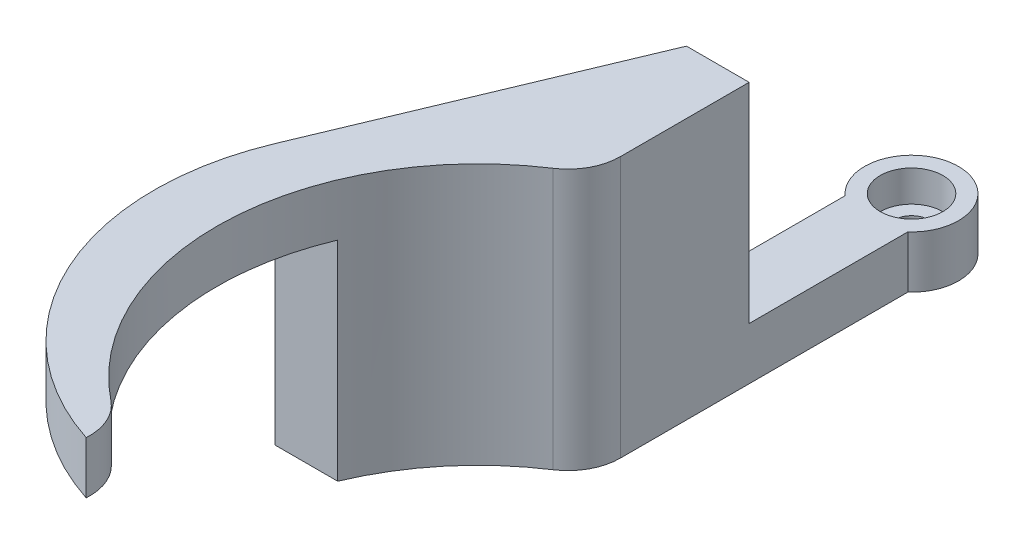
ISO-10303-21;
HEADER;
FILE_DESCRIPTION(('STEP AP214'),'2;1');
FILE_NAME('part.step','',(''),(''),'','','');
FILE_SCHEMA(('AUTOMOTIVE_DESIGN { 1 0 10303 214 1 1 1 1 }'));
ENDSEC;
DATA;
#1=APPLICATION_CONTEXT('core data for automotive mechanical design processes');
#2=APPLICATION_PROTOCOL_DEFINITION('international standard','automotive_design',2000,#1);
#3=PRODUCT_CONTEXT('',#1,'mechanical');
#4=PRODUCT('Part','Part','',(#3));
#5=PRODUCT_RELATED_PRODUCT_CATEGORY('part','',(#4));
#6=PRODUCT_DEFINITION_FORMATION('','',#4);
#7=PRODUCT_DEFINITION_CONTEXT('part definition',#1,'design');
#8=PRODUCT_DEFINITION('design','',#6,#7);
#9=PRODUCT_DEFINITION_SHAPE('','',#8);
#10=(LENGTH_UNIT() NAMED_UNIT(*) SI_UNIT(.MILLI.,.METRE.));
#11=(NAMED_UNIT(*) PLANE_ANGLE_UNIT() SI_UNIT($,.RADIAN.));
#12=(NAMED_UNIT(*) SI_UNIT($,.STERADIAN.) SOLID_ANGLE_UNIT());
#13=UNCERTAINTY_MEASURE_WITH_UNIT(LENGTH_MEASURE(1.E-05),#10,'distance_accuracy_value','');
#14=(GEOMETRIC_REPRESENTATION_CONTEXT(3) GLOBAL_UNCERTAINTY_ASSIGNED_CONTEXT((#13)) GLOBAL_UNIT_ASSIGNED_CONTEXT((#10,
#11,#12)) REPRESENTATION_CONTEXT('',''));
#15=CARTESIAN_POINT('',(0.,0.,0.));
#16=DIRECTION('',(0.,0.,1.));
#17=DIRECTION('',(1.,0.,0.));
#18=AXIS2_PLACEMENT_3D('',#15,#16,#17);
#19=CARTESIAN_POINT('',(0.,5.,0.));
#20=DIRECTION('',(0.,1.,0.));
#21=DIRECTION('',(0.,0.,1.));
#22=AXIS2_PLACEMENT_3D('',#19,#20,#21);
#23=PLANE('',#22);
#24=CARTESIAN_POINT('',(0.,5.,0.));
#25=DIRECTION('',(0.,1.,0.));
#26=DIRECTION('',(0.,0.,1.));
#27=AXIS2_PLACEMENT_3D('',#24,#25,#26);
#28=CIRCLE('',#27,3.);
#29=CARTESIAN_POINT('',(0.,5.,3.));
#30=VERTEX_POINT('',#29);
#31=EDGE_CURVE('E169',#30,#30,#28,.T.);
#32=ORIENTED_EDGE('',*,*,#31,.F.);
#33=EDGE_LOOP('',(#32));
#34=FACE_BOUND('',#33,.T.);
#35=DIRECTION('',(0.,0.,1.));
#36=VECTOR('',#35,1.);
#37=CARTESIAN_POINT('',(-3.,5.,7.41619848709566));
#38=LINE('',#37,#36);
#39=CARTESIAN_POINT('',(-3.,5.,3.35410196624968));
#40=VERTEX_POINT('',#39);
#41=CARTESIAN_POINT('',(-2.99999999999999,5.,18.5500745429482));
#42=VERTEX_POINT('',#41);
#43=EDGE_CURVE('E172',#40,#42,#38,.T.);
#44=ORIENTED_EDGE('',*,*,#43,.T.);
#45=DIRECTION('',(1.,0.,0.));
#46=VECTOR('',#45,1.);
#47=CARTESIAN_POINT('',(0.,5.,18.5500745429482));
#48=LINE('',#47,#46);
#49=CARTESIAN_POINT('',(3.,5.,18.5500745429482));
#50=VERTEX_POINT('',#49);
#51=EDGE_CURVE('E61',#42,#50,#48,.T.);
#52=ORIENTED_EDGE('',*,*,#51,.T.);
#53=DIRECTION('',(0.,0.,-1.));
#54=VECTOR('',#53,1.);
#55=CARTESIAN_POINT('',(3.00000000000001,5.,43.8541019662497));
#56=LINE('',#55,#54);
#57=CARTESIAN_POINT('',(3.,5.,3.35410196624968));
#58=VERTEX_POINT('',#57);
#59=EDGE_CURVE('E175',#50,#58,#56,.T.);
#60=ORIENTED_EDGE('',*,*,#59,.T.);
#61=CARTESIAN_POINT('',(0.,5.,0.));
#62=DIRECTION('',(0.,1.,0.));
#63=DIRECTION('',(0.,0.,1.));
#64=AXIS2_PLACEMENT_3D('',#61,#62,#63);
#65=CIRCLE('',#64,4.5);
#66=EDGE_CURVE('E179',#58,#40,#65,.T.);
#67=ORIENTED_EDGE('',*,*,#66,.T.);
#68=EDGE_LOOP('',(#44,#52,#60,#67));
#69=FACE_BOUND('',#68,.T.);
#70=ADVANCED_FACE('F45',(#34,#69),#23,.T.);
#71=CARTESIAN_POINT('',(0.,-4.66690475583121,0.));
#72=DIRECTION('',(0.,1.,0.));
#73=DIRECTION('',(0.,0.,1.));
#74=AXIS2_PLACEMENT_3D('',#71,#72,#73);
#75=CYLINDRICAL_SURFACE('',#74,1.65);
#76=CARTESIAN_POINT('',(0.,0.,0.));
#77=DIRECTION('',(0.,1.,0.));
#78=DIRECTION('',(0.,0.,1.));
#79=AXIS2_PLACEMENT_3D('',#76,#77,#78);
#80=CIRCLE('',#79,1.65);
#81=CARTESIAN_POINT('',(0.,0.,1.65));
#82=VERTEX_POINT('',#81);
#83=EDGE_CURVE('E157',#82,#82,#80,.F.);
#84=ORIENTED_EDGE('',*,*,#83,.T.);
#85=EDGE_LOOP('',(#84));
#86=FACE_BOUND('',#85,.T.);
#87=CARTESIAN_POINT('',(0.,2.,0.));
#88=DIRECTION('',(0.,1.,0.));
#89=DIRECTION('',(0.,0.,1.));
#90=AXIS2_PLACEMENT_3D('',#87,#88,#89);
#91=CIRCLE('',#90,1.65);
#92=CARTESIAN_POINT('',(0.,2.,1.65));
#93=VERTEX_POINT('',#92);
#94=EDGE_CURVE('E158',#93,#93,#91,.F.);
#95=ORIENTED_EDGE('',*,*,#94,.F.);
#96=EDGE_LOOP('',(#95));
#97=FACE_BOUND('',#96,.T.);
#98=ADVANCED_FACE('F274',(#86,#97),#75,.F.);
#99=CARTESIAN_POINT('',(3.,5.,3.35410196624968));
#100=DIRECTION('',(-1.,0.,0.));
#101=DIRECTION('',(0.,0.,1.));
#102=AXIS2_PLACEMENT_3D('',#99,#100,#101);
#103=PLANE('',#102);
#104=ORIENTED_EDGE('',*,*,#59,.F.);
#105=DIRECTION('',(0.,-1.,0.));
#106=VECTOR('',#105,1.);
#107=CARTESIAN_POINT('',(3.,20.,18.5500745429482));
#108=LINE('',#107,#106);
#109=CARTESIAN_POINT('',(3.,25.,18.5500745429482));
#110=VERTEX_POINT('',#109);
#111=EDGE_CURVE('E140',#110,#50,#108,.T.);
#112=ORIENTED_EDGE('',*,*,#111,.F.);
#113=DIRECTION('',(0.,0.,-1.));
#114=VECTOR('',#113,1.);
#115=CARTESIAN_POINT('',(3.00000000000001,25.,30.8819886854511));
#116=LINE('',#115,#114);
#117=CARTESIAN_POINT('',(3.00000000000001,25.,30.8819886854511));
#118=VERTEX_POINT('',#117);
#119=EDGE_CURVE('E219',#118,#110,#116,.T.);
#120=ORIENTED_EDGE('',*,*,#119,.F.);
#121=DIRECTION('',(0.,-1.,0.));
#122=VECTOR('',#121,1.);
#123=CARTESIAN_POINT('',(3.00000000000001,0.,30.8819886854511));
#124=LINE('',#123,#122);
#125=CARTESIAN_POINT('',(3.00000000000001,0.,30.8819886854511));
#126=VERTEX_POINT('',#125);
#127=EDGE_CURVE('E11',#118,#126,#124,.T.);
#128=ORIENTED_EDGE('',*,*,#127,.T.);
#129=DIRECTION('',(0.,0.,-1.));
#130=VECTOR('',#129,1.);
#131=CARTESIAN_POINT('',(3.,0.,3.35410196624968));
#132=LINE('',#131,#130);
#133=CARTESIAN_POINT('',(3.,0.,3.35410196624968));
#134=VERTEX_POINT('',#133);
#135=EDGE_CURVE('E163',#126,#134,#132,.T.);
#136=ORIENTED_EDGE('',*,*,#135,.T.);
#137=DIRECTION('',(0.,-1.,0.));
#138=VECTOR('',#137,1.);
#139=CARTESIAN_POINT('',(3.,5.,3.35410196624968));
#140=LINE('',#139,#138);
#141=EDGE_CURVE('E195',#58,#134,#140,.T.);
#142=ORIENTED_EDGE('',*,*,#141,.F.);
#143=EDGE_LOOP('',(#104,#112,#120,#128,#136,#142));
#144=FACE_BOUND('',#143,.T.);
#145=ADVANCED_FACE('F287',(#144),#103,.F.);
#146=CARTESIAN_POINT('',(0.,5.,0.));
#147=DIRECTION('',(0.,-1.,0.));
#148=DIRECTION('',(0.,0.,-1.));
#149=AXIS2_PLACEMENT_3D('',#146,#147,#148);
#150=CYLINDRICAL_SURFACE('',#149,4.5);
#151=CARTESIAN_POINT('',(0.,0.,0.));
#152=DIRECTION('',(0.,1.,0.));
#153=DIRECTION('',(0.,0.,1.));
#154=AXIS2_PLACEMENT_3D('',#151,#152,#153);
#155=CIRCLE('',#154,4.5);
#156=CARTESIAN_POINT('',(-3.,0.,3.35410196624968));
#157=VERTEX_POINT('',#156);
#158=EDGE_CURVE('E186',#134,#157,#155,.T.);
#159=ORIENTED_EDGE('',*,*,#158,.T.);
#160=DIRECTION('',(0.,-1.,0.));
#161=VECTOR('',#160,1.);
#162=CARTESIAN_POINT('',(-3.,5.,3.35410196624968));
#163=LINE('',#162,#161);
#164=EDGE_CURVE('E183',#40,#157,#163,.T.);
#165=ORIENTED_EDGE('',*,*,#164,.F.);
#166=ORIENTED_EDGE('',*,*,#66,.F.);
#167=ORIENTED_EDGE('',*,*,#141,.T.);
#168=EDGE_LOOP('',(#159,#165,#166,#167));
#169=FACE_BOUND('',#168,.T.);
#170=ADVANCED_FACE('F311',(#169),#150,.T.);
#171=CARTESIAN_POINT('',(-3.,5.,3.35410196624968));
#172=DIRECTION('',(1.,0.,0.));
#173=DIRECTION('',(0.,0.,-1.));
#174=AXIS2_PLACEMENT_3D('',#171,#172,#173);
#175=PLANE('',#174);
#176=DIRECTION('',(0.,0.,1.));
#177=VECTOR('',#176,1.);
#178=CARTESIAN_POINT('',(-3.,0.,3.35410196624968));
#179=LINE('',#178,#177);
#180=CARTESIAN_POINT('',(-2.99999999999999,0.,18.5500745429482));
#181=VERTEX_POINT('',#180);
#182=EDGE_CURVE('E176',#157,#181,#179,.T.);
#183=ORIENTED_EDGE('',*,*,#182,.T.);
#184=DIRECTION('',(0.,1.,0.));
#185=VECTOR('',#184,1.);
#186=CARTESIAN_POINT('',(-2.99999999999999,0.,18.5500745429482));
#187=LINE('',#186,#185);
#188=EDGE_CURVE('E259',#181,#42,#187,.T.);
#189=ORIENTED_EDGE('',*,*,#188,.T.);
#190=ORIENTED_EDGE('',*,*,#43,.F.);
#191=ORIENTED_EDGE('',*,*,#164,.T.);
#192=EDGE_LOOP('',(#183,#189,#190,#191));
#193=FACE_BOUND('',#192,.T.);
#194=ADVANCED_FACE('F309',(#193),#175,.F.);
#195=CARTESIAN_POINT('',(0.,0.,0.));
#196=DIRECTION('',(0.,1.,0.));
#197=DIRECTION('',(0.,0.,1.));
#198=AXIS2_PLACEMENT_3D('',#195,#196,#197);
#199=PLANE('',#198);
#200=CARTESIAN_POINT('',(14.4495202218953,0.,55.9700991059163));
#201=DIRECTION('',(0.,-1.,0.));
#202=DIRECTION('',(0.,0.,1.));
#203=AXIS2_PLACEMENT_3D('',#200,#201,#202);
#204=CIRCLE('',#203,25.);
#205=CARTESIAN_POINT('',(-8.61496768407357,0.,46.3249242689621));
#206=VERTEX_POINT('',#205);
#207=CARTESIAN_POINT('',(0.741586703649219,0.,35.0633404221953));
#208=VERTEX_POINT('',#207);
#209=EDGE_CURVE('E131',#206,#208,#204,.T.);
#210=ORIENTED_EDGE('',*,*,#209,.F.);
#211=DIRECTION('',(-1.,0.,0.));
#212=VECTOR('',#211,1.);
#213=CARTESIAN_POINT('',(-8.61496768407357,0.,46.3249242689621));
#214=LINE('',#213,#212);
#215=CARTESIAN_POINT('',(-14.6149676840736,0.,46.3249242689621));
#216=VERTEX_POINT('',#215);
#217=EDGE_CURVE('E143',#206,#216,#214,.T.);
#218=ORIENTED_EDGE('',*,*,#217,.T.);
#219=DIRECTION('',(-0.38580699347817,0.,0.922579516238755));
#220=VECTOR('',#219,1.);
#221=CARTESIAN_POINT('',(-2.99999999999999,0.,18.5500745429482));
#222=LINE('',#221,#220);
#223=EDGE_CURVE('E139',#181,#216,#222,.T.);
#224=ORIENTED_EDGE('',*,*,#223,.F.);
#225=ORIENTED_EDGE('',*,*,#182,.F.);
#226=ORIENTED_EDGE('',*,*,#158,.F.);
#227=ORIENTED_EDGE('',*,*,#135,.F.);
#228=CARTESIAN_POINT('',(-1.99999999999999,0.,30.8819886854511));
#229=DIRECTION('',(0.,1.,0.));
#230=DIRECTION('',(0.,0.,1.));
#231=AXIS2_PLACEMENT_3D('',#228,#229,#230);
#232=CIRCLE('',#231,5.);
#233=EDGE_CURVE('E54',#126,#208,#232,.F.);
#234=ORIENTED_EDGE('',*,*,#233,.T.);
#235=EDGE_LOOP('',(#210,#218,#224,#225,#226,#227,#234));
#236=FACE_BOUND('',#235,.T.);
#237=ORIENTED_EDGE('',*,*,#83,.F.);
#238=EDGE_LOOP('',(#237));
#239=FACE_BOUND('',#238,.T.);
#240=ADVANCED_FACE('F152',(#236,#239),#199,.F.);
#241=CARTESIAN_POINT('',(14.4495202218953,0.,55.9700991059163));
#242=DIRECTION('',(0.,1.,0.));
#243=DIRECTION('',(0.,0.,1.));
#244=AXIS2_PLACEMENT_3D('',#241,#242,#243);
#245=CYLINDRICAL_SURFACE('',#244,25.);
#246=DIRECTION('',(0.,-1.,0.));
#247=VECTOR('',#246,1.);
#248=CARTESIAN_POINT('',(-8.61496768407357,20.,46.3249242689621));
#249=LINE('',#248,#247);
#250=CARTESIAN_POINT('',(-8.61496768407357,20.,46.3249242689621));
#251=VERTEX_POINT('',#250);
#252=EDGE_CURVE('E127',#251,#206,#249,.T.);
#253=ORIENTED_EDGE('',*,*,#252,.T.);
#254=ORIENTED_EDGE('',*,*,#209,.T.);
#255=DIRECTION('',(0.,1.,0.));
#256=VECTOR('',#255,1.);
#257=CARTESIAN_POINT('',(0.741586703649219,0.,35.0633404221953));
#258=LINE('',#257,#256);
#259=CARTESIAN_POINT('',(0.741586703649228,25.,35.0633404221953));
#260=VERTEX_POINT('',#259);
#261=EDGE_CURVE('E198',#208,#260,#258,.T.);
#262=ORIENTED_EDGE('',*,*,#261,.T.);
#263=CARTESIAN_POINT('',(14.4495202218953,25.,55.9700991059163));
#264=DIRECTION('',(0.,-1.,0.));
#265=DIRECTION('',(0.,0.,1.));
#266=AXIS2_PLACEMENT_3D('',#263,#264,#265);
#267=CIRCLE('',#266,25.);
#268=CARTESIAN_POINT('',(-1.14724087166777,25.,75.5082935821293));
#269=VERTEX_POINT('',#268);
#270=EDGE_CURVE('E204',#269,#260,#267,.T.);
#271=ORIENTED_EDGE('',*,*,#270,.F.);
#272=DIRECTION('',(0.,-1.,0.));
#273=VECTOR('',#272,1.);
#274=CARTESIAN_POINT('',(-1.14724087166777,25.,75.5082935821293));
#275=LINE('',#274,#273);
#276=CARTESIAN_POINT('',(-1.14724087166777,20.,75.5082935821293));
#277=VERTEX_POINT('',#276);
#278=EDGE_CURVE('E222',#269,#277,#275,.T.);
#279=ORIENTED_EDGE('',*,*,#278,.T.);
#280=CARTESIAN_POINT('',(14.4495202218953,20.,55.9700991059163));
#281=DIRECTION('',(0.,-1.,0.));
#282=DIRECTION('',(0.,0.,1.));
#283=AXIS2_PLACEMENT_3D('',#280,#281,#282);
#284=CIRCLE('',#283,25.);
#285=EDGE_CURVE('E134',#277,#251,#284,.T.);
#286=ORIENTED_EDGE('',*,*,#285,.T.);
#287=EDGE_LOOP('',(#253,#254,#262,#271,#279,#286));
#288=FACE_BOUND('',#287,.T.);
#289=ADVANCED_FACE('F129',(#288),#245,.F.);
#290=CARTESIAN_POINT('',(0.,2.,0.));
#291=DIRECTION('',(0.,1.,0.));
#292=DIRECTION('',(0.,0.,1.));
#293=AXIS2_PLACEMENT_3D('',#290,#291,#292);
#294=PLANE('',#293);
#295=CARTESIAN_POINT('',(0.,2.,0.));
#296=DIRECTION('',(0.,1.,0.));
#297=DIRECTION('',(0.,0.,1.));
#298=AXIS2_PLACEMENT_3D('',#295,#296,#297);
#299=CIRCLE('',#298,3.);
#300=CARTESIAN_POINT('',(0.,2.,3.));
#301=VERTEX_POINT('',#300);
#302=EDGE_CURVE('E166',#301,#301,#299,.T.);
#303=ORIENTED_EDGE('',*,*,#302,.T.);
#304=EDGE_LOOP('',(#303));
#305=FACE_BOUND('',#304,.T.);
#306=ORIENTED_EDGE('',*,*,#94,.T.);
#307=EDGE_LOOP('',(#306));
#308=FACE_BOUND('',#307,.T.);
#309=ADVANCED_FACE('F328',(#305,#308),#294,.T.);
#310=CARTESIAN_POINT('',(0.,2.,0.));
#311=DIRECTION('',(0.,1.,0.));
#312=DIRECTION('',(0.,0.,1.));
#313=AXIS2_PLACEMENT_3D('',#310,#311,#312);
#314=CYLINDRICAL_SURFACE('',#313,3.);
#315=ORIENTED_EDGE('',*,*,#302,.F.);
#316=EDGE_LOOP('',(#315));
#317=FACE_BOUND('',#316,.T.);
#318=ORIENTED_EDGE('',*,*,#31,.T.);
#319=EDGE_LOOP('',(#318));
#320=FACE_BOUND('',#319,.T.);
#321=ADVANCED_FACE('F271',(#317,#320),#314,.F.);
#322=CARTESIAN_POINT('',(-2.99999999999999,0.,18.5500745429482));
#323=DIRECTION('',(-0.922579516238755,0.,-0.38580699347817));
#324=DIRECTION('',(-0.38580699347817,0.,0.922579516238755));
#325=AXIS2_PLACEMENT_3D('',#322,#323,#324);
#326=PLANE('',#325);
#327=DIRECTION('',(0.,1.,0.));
#328=VECTOR('',#327,1.);
#329=CARTESIAN_POINT('',(-14.6149676840736,0.,46.3249242689621));
#330=LINE('',#329,#328);
#331=CARTESIAN_POINT('',(-14.6149676840736,20.,46.3249242689621));
#332=VERTEX_POINT('',#331);
#333=EDGE_CURVE('E145',#216,#332,#330,.T.);
#334=ORIENTED_EDGE('',*,*,#333,.T.);
#335=DIRECTION('',(0.,-1.,0.));
#336=VECTOR('',#335,1.);
#337=CARTESIAN_POINT('',(-14.6149676840736,25.,46.3249242689621));
#338=LINE('',#337,#336);
#339=CARTESIAN_POINT('',(-14.6149676840736,25.,46.3249242689621));
#340=VERTEX_POINT('',#339);
#341=EDGE_CURVE('E241',#340,#332,#338,.T.);
#342=ORIENTED_EDGE('',*,*,#341,.F.);
#343=DIRECTION('',(-0.38580699347817,0.,0.922579516238755));
#344=VECTOR('',#343,1.);
#345=CARTESIAN_POINT('',(-2.99999999999999,25.,18.5500745429482));
#346=LINE('',#345,#344);
#347=CARTESIAN_POINT('',(-2.99999999999999,25.,18.5500745429482));
#348=VERTEX_POINT('',#347);
#349=EDGE_CURVE('E283',#348,#340,#346,.T.);
#350=ORIENTED_EDGE('',*,*,#349,.F.);
#351=DIRECTION('',(0.,-1.,0.));
#352=VECTOR('',#351,1.);
#353=CARTESIAN_POINT('',(-2.99999999999999,20.,18.5500745429482));
#354=LINE('',#353,#352);
#355=EDGE_CURVE('E248',#348,#42,#354,.T.);
#356=ORIENTED_EDGE('',*,*,#355,.T.);
#357=ORIENTED_EDGE('',*,*,#188,.F.);
#358=ORIENTED_EDGE('',*,*,#223,.T.);
#359=EDGE_LOOP('',(#334,#342,#350,#356,#357,#358));
#360=FACE_BOUND('',#359,.T.);
#361=ADVANCED_FACE('F281',(#360),#326,.T.);
#362=CARTESIAN_POINT('',(-1.99999999999999,0.,30.8819886854511));
#363=DIRECTION('',(0.,1.,0.));
#364=DIRECTION('',(0.,0.,1.));
#365=AXIS2_PLACEMENT_3D('',#362,#363,#364);
#366=CYLINDRICAL_SURFACE('',#365,5.);
#367=ORIENTED_EDGE('',*,*,#233,.F.);
#368=ORIENTED_EDGE('',*,*,#127,.F.);
#369=CARTESIAN_POINT('',(-1.99999999999999,25.,30.8819886854511));
#370=DIRECTION('',(0.,1.,0.));
#371=DIRECTION('',(0.,0.,1.));
#372=AXIS2_PLACEMENT_3D('',#369,#370,#371);
#373=CIRCLE('',#372,5.);
#374=EDGE_CURVE('E212',#260,#118,#373,.T.);
#375=ORIENTED_EDGE('',*,*,#374,.F.);
#376=ORIENTED_EDGE('',*,*,#261,.F.);
#377=EDGE_LOOP('',(#367,#368,#375,#376));
#378=FACE_BOUND('',#377,.T.);
#379=ADVANCED_FACE('F47',(#378),#366,.T.);
#380=CARTESIAN_POINT('',(0.,20.,46.3249242689621));
#381=DIRECTION('',(0.,0.,-1.));
#382=DIRECTION('',(-1.,0.,0.));
#383=AXIS2_PLACEMENT_3D('',#380,#381,#382);
#384=PLANE('',#383);
#385=DIRECTION('',(1.,0.,0.));
#386=VECTOR('',#385,1.);
#387=CARTESIAN_POINT('',(0.,20.,46.3249242689621));
#388=LINE('',#387,#386);
#389=EDGE_CURVE('E245',#332,#251,#388,.T.);
#390=ORIENTED_EDGE('',*,*,#389,.F.);
#391=ORIENTED_EDGE('',*,*,#333,.F.);
#392=ORIENTED_EDGE('',*,*,#217,.F.);
#393=ORIENTED_EDGE('',*,*,#252,.F.);
#394=EDGE_LOOP('',(#390,#391,#392,#393));
#395=FACE_BOUND('',#394,.T.);
#396=ADVANCED_FACE('F144',(#395),#384,.F.);
#397=CARTESIAN_POINT('',(0.,20.,18.5500745429482));
#398=DIRECTION('',(0.,0.,-1.));
#399=DIRECTION('',(-1.,0.,0.));
#400=AXIS2_PLACEMENT_3D('',#397,#398,#399);
#401=PLANE('',#400);
#402=ORIENTED_EDGE('',*,*,#51,.F.);
#403=ORIENTED_EDGE('',*,*,#355,.F.);
#404=DIRECTION('',(-1.,0.,0.));
#405=VECTOR('',#404,1.);
#406=CARTESIAN_POINT('',(3.,25.,18.5500745429482));
#407=LINE('',#406,#405);
#408=EDGE_CURVE('E234',#110,#348,#407,.T.);
#409=ORIENTED_EDGE('',*,*,#408,.F.);
#410=ORIENTED_EDGE('',*,*,#111,.T.);
#411=EDGE_LOOP('',(#402,#403,#409,#410));
#412=FACE_BOUND('',#411,.T.);
#413=ADVANCED_FACE('F286',(#412),#401,.T.);
#414=CARTESIAN_POINT('',(8.4495202218953,25.,55.9700991059163));
#415=DIRECTION('',(0.,-1.,0.));
#416=DIRECTION('',(0.,0.,-1.));
#417=AXIS2_PLACEMENT_3D('',#414,#415,#416);
#418=CYLINDRICAL_SURFACE('',#417,25.);
#419=CARTESIAN_POINT('',(8.4495202218953,20.,55.9700991059163));
#420=DIRECTION('',(0.,1.,0.));
#421=DIRECTION('',(0.,0.,1.));
#422=AXIS2_PLACEMENT_3D('',#419,#420,#421);
#423=CIRCLE('',#422,25.);
#424=CARTESIAN_POINT('',(0.722500961257968,20.,79.7459939018171));
#425=VERTEX_POINT('',#424);
#426=EDGE_CURVE('E150',#332,#425,#423,.T.);
#427=ORIENTED_EDGE('',*,*,#426,.T.);
#428=DIRECTION('',(0.,-1.,0.));
#429=VECTOR('',#428,1.);
#430=CARTESIAN_POINT('',(0.722500961257968,25.,79.7459939018171));
#431=LINE('',#430,#429);
#432=CARTESIAN_POINT('',(0.722500961257968,25.,79.7459939018171));
#433=VERTEX_POINT('',#432);
#434=EDGE_CURVE('E237',#433,#425,#431,.T.);
#435=ORIENTED_EDGE('',*,*,#434,.F.);
#436=CARTESIAN_POINT('',(8.4495202218953,25.,55.9700991059163));
#437=DIRECTION('',(0.,1.,0.));
#438=DIRECTION('',(0.,0.,1.));
#439=AXIS2_PLACEMENT_3D('',#436,#437,#438);
#440=CIRCLE('',#439,25.);
#441=EDGE_CURVE('E292',#340,#433,#440,.T.);
#442=ORIENTED_EDGE('',*,*,#441,.F.);
#443=ORIENTED_EDGE('',*,*,#341,.T.);
#444=EDGE_LOOP('',(#427,#435,#442,#443));
#445=FACE_BOUND('',#444,.T.);
#446=ADVANCED_FACE('F300',(#445),#418,.T.);
#447=CARTESIAN_POINT('',(-4.26659309038037,25.,79.4159324773719));
#448=DIRECTION('',(0.,-1.,0.));
#449=DIRECTION('',(0.,0.,-1.));
#450=AXIS2_PLACEMENT_3D('',#447,#448,#449);
#451=CYLINDRICAL_SURFACE('',#450,4.99999999999999);
#452=CARTESIAN_POINT('',(-4.26659309038037,20.,79.4159324773719));
#453=DIRECTION('',(0.,1.,0.));
#454=DIRECTION('',(0.,0.,1.));
#455=AXIS2_PLACEMENT_3D('',#452,#453,#454);
#456=CIRCLE('',#455,4.99999999999999);
#457=EDGE_CURVE('E228',#425,#277,#456,.T.);
#458=ORIENTED_EDGE('',*,*,#457,.T.);
#459=ORIENTED_EDGE('',*,*,#278,.F.);
#460=CARTESIAN_POINT('',(-4.26659309038037,25.,79.4159324773719));
#461=DIRECTION('',(0.,1.,0.));
#462=DIRECTION('',(0.,0.,1.));
#463=AXIS2_PLACEMENT_3D('',#460,#461,#462);
#464=CIRCLE('',#463,4.99999999999999);
#465=EDGE_CURVE('E214',#433,#269,#464,.T.);
#466=ORIENTED_EDGE('',*,*,#465,.F.);
#467=ORIENTED_EDGE('',*,*,#434,.T.);
#468=EDGE_LOOP('',(#458,#459,#466,#467));
#469=FACE_BOUND('',#468,.T.);
#470=ADVANCED_FACE('F304',(#469),#451,.T.);
#471=CARTESIAN_POINT('',(8.4495202218953,25.,55.9700991059163));
#472=DIRECTION('',(0.,1.,0.));
#473=DIRECTION('',(0.,0.,1.));
#474=AXIS2_PLACEMENT_3D('',#471,#472,#473);
#475=PLANE('',#474);
#476=ORIENTED_EDGE('',*,*,#408,.T.);
#477=ORIENTED_EDGE('',*,*,#349,.T.);
#478=ORIENTED_EDGE('',*,*,#441,.T.);
#479=ORIENTED_EDGE('',*,*,#465,.T.);
#480=ORIENTED_EDGE('',*,*,#270,.T.);
#481=ORIENTED_EDGE('',*,*,#374,.T.);
#482=ORIENTED_EDGE('',*,*,#119,.T.);
#483=EDGE_LOOP('',(#476,#477,#478,#479,#480,#481,#482));
#484=FACE_BOUND('',#483,.T.);
#485=ADVANCED_FACE('F210',(#484),#475,.T.);
#486=CARTESIAN_POINT('',(8.4495202218953,20.,55.9700991059163));
#487=DIRECTION('',(0.,1.,0.));
#488=DIRECTION('',(0.,0.,1.));
#489=AXIS2_PLACEMENT_3D('',#486,#487,#488);
#490=PLANE('',#489);
#491=ORIENTED_EDGE('',*,*,#426,.F.);
#492=ORIENTED_EDGE('',*,*,#389,.T.);
#493=ORIENTED_EDGE('',*,*,#285,.F.);
#494=ORIENTED_EDGE('',*,*,#457,.F.);
#495=EDGE_LOOP('',(#491,#492,#493,#494));
#496=FACE_BOUND('',#495,.T.);
#497=ADVANCED_FACE('F306',(#496),#490,.F.);
#498=CLOSED_SHELL('',(#70,#98,#145,#170,#194,#240,#289,#309,#321,#361,#379,#396,#413,#446,#470,
#485,#497));
#499=MANIFOLD_SOLID_BREP('B2',#498);
#500=ADVANCED_BREP_SHAPE_REPRESENTATION('',(#18,#499),#14);
#501=SHAPE_DEFINITION_REPRESENTATION(#9,#500);
ENDSEC;
END-ISO-10303-21;
